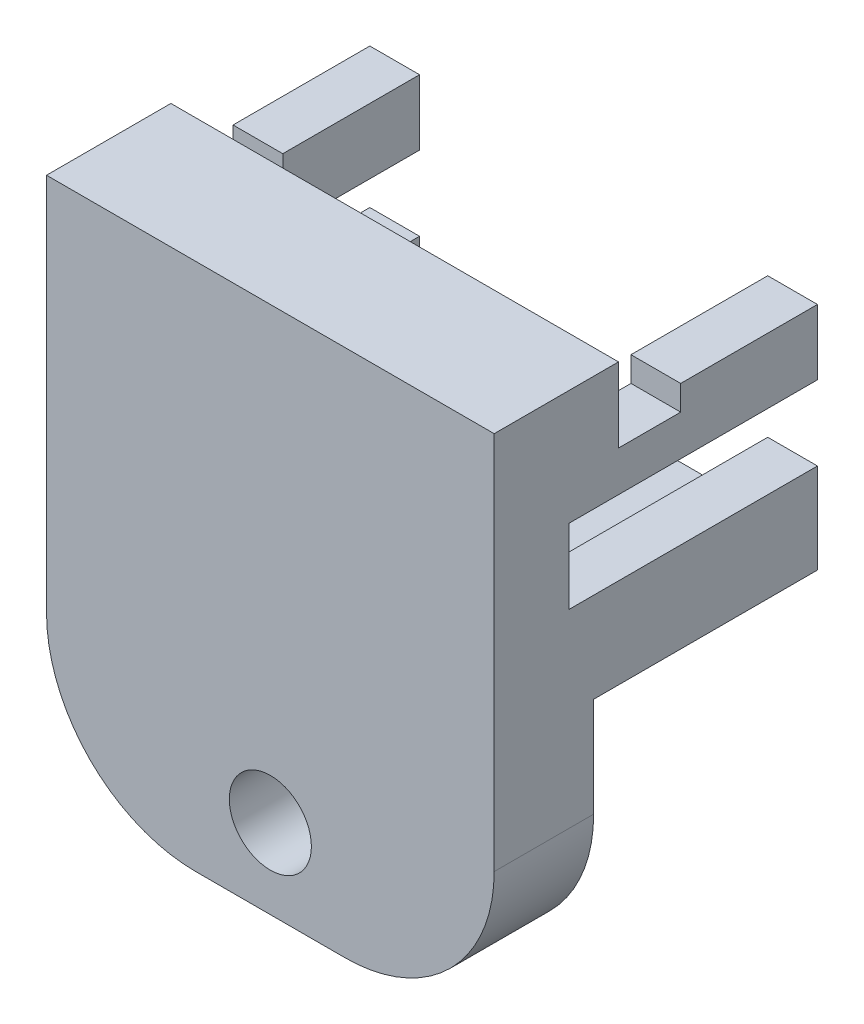
ISO-10303-21;
HEADER;
FILE_DESCRIPTION(('STEP AP214'),'2;1');
FILE_NAME('part.step','',(''),(''),'','','');
FILE_SCHEMA(('AUTOMOTIVE_DESIGN { 1 0 10303 214 1 1 1 1 }'));
ENDSEC;
DATA;
#1=APPLICATION_CONTEXT('core data for automotive mechanical design processes');
#2=APPLICATION_PROTOCOL_DEFINITION('international standard','automotive_design',2000,#1);
#3=PRODUCT_CONTEXT('',#1,'mechanical');
#4=PRODUCT('Part','Part','',(#3));
#5=PRODUCT_RELATED_PRODUCT_CATEGORY('part','',(#4));
#6=PRODUCT_DEFINITION_FORMATION('','',#4);
#7=PRODUCT_DEFINITION_CONTEXT('part definition',#1,'design');
#8=PRODUCT_DEFINITION('design','',#6,#7);
#9=PRODUCT_DEFINITION_SHAPE('','',#8);
#10=(LENGTH_UNIT() NAMED_UNIT(*) SI_UNIT(.MILLI.,.METRE.));
#11=(NAMED_UNIT(*) PLANE_ANGLE_UNIT() SI_UNIT($,.RADIAN.));
#12=(NAMED_UNIT(*) SI_UNIT($,.STERADIAN.) SOLID_ANGLE_UNIT());
#13=UNCERTAINTY_MEASURE_WITH_UNIT(LENGTH_MEASURE(1.E-05),#10,'distance_accuracy_value','');
#14=(GEOMETRIC_REPRESENTATION_CONTEXT(3) GLOBAL_UNCERTAINTY_ASSIGNED_CONTEXT((#13)) GLOBAL_UNIT_ASSIGNED_CONTEXT((#10,
#11,#12)) REPRESENTATION_CONTEXT('',''));
#15=CARTESIAN_POINT('',(0.,0.,0.));
#16=DIRECTION('',(0.,0.,1.));
#17=DIRECTION('',(1.,0.,0.));
#18=AXIS2_PLACEMENT_3D('',#15,#16,#17);
#19=CARTESIAN_POINT('',(0.,0.,-10.));
#20=DIRECTION('',(0.,0.,-1.));
#21=DIRECTION('',(-1.,0.,0.));
#22=AXIS2_PLACEMENT_3D('',#19,#20,#21);
#23=PLANE('',#22);
#24=DIRECTION('',(0.,-1.,0.));
#25=VECTOR('',#24,1.);
#26=CARTESIAN_POINT('',(9.,7.625,-10.));
#27=LINE('',#26,#25);
#28=CARTESIAN_POINT('',(9.,7.625,-10.));
#29=VERTEX_POINT('',#28);
#30=CARTESIAN_POINT('',(9.,4.,-10.));
#31=VERTEX_POINT('',#30);
#32=EDGE_CURVE('E358',#29,#31,#27,.T.);
#33=ORIENTED_EDGE('',*,*,#32,.T.);
#34=DIRECTION('',(1.,0.,0.));
#35=VECTOR('',#34,1.);
#36=CARTESIAN_POINT('',(-9.,4.,-10.));
#37=LINE('',#36,#35);
#38=CARTESIAN_POINT('',(-9.,4.,-10.));
#39=VERTEX_POINT('',#38);
#40=EDGE_CURVE('E268',#39,#31,#37,.T.);
#41=ORIENTED_EDGE('',*,*,#40,.F.);
#42=DIRECTION('',(0.,1.,0.));
#43=VECTOR('',#42,1.);
#44=CARTESIAN_POINT('',(-9.,3.,-10.));
#45=LINE('',#44,#43);
#46=CARTESIAN_POINT('',(-9.,7.625,-10.));
#47=VERTEX_POINT('',#46);
#48=EDGE_CURVE('E360',#39,#47,#45,.T.);
#49=ORIENTED_EDGE('',*,*,#48,.T.);
#50=DIRECTION('',(1.,0.,0.));
#51=VECTOR('',#50,1.);
#52=CARTESIAN_POINT('',(-9.,7.625,-10.));
#53=LINE('',#52,#51);
#54=CARTESIAN_POINT('',(-7.,7.625,-10.));
#55=VERTEX_POINT('',#54);
#56=EDGE_CURVE('E348',#47,#55,#53,.T.);
#57=ORIENTED_EDGE('',*,*,#56,.T.);
#58=DIRECTION('',(0.,-1.,0.));
#59=VECTOR('',#58,1.);
#60=CARTESIAN_POINT('',(-7.,7.625,-10.));
#61=LINE('',#60,#59);
#62=CARTESIAN_POINT('',(-7.,5.,-10.));
#63=VERTEX_POINT('',#62);
#64=EDGE_CURVE('E350',#55,#63,#61,.T.);
#65=ORIENTED_EDGE('',*,*,#64,.T.);
#66=DIRECTION('',(1.,0.,0.));
#67=VECTOR('',#66,1.);
#68=CARTESIAN_POINT('',(-7.,5.,-10.));
#69=LINE('',#68,#67);
#70=CARTESIAN_POINT('',(7.,5.,-10.));
#71=VERTEX_POINT('',#70);
#72=EDGE_CURVE('E352',#63,#71,#69,.T.);
#73=ORIENTED_EDGE('',*,*,#72,.T.);
#74=DIRECTION('',(0.,1.,0.));
#75=VECTOR('',#74,1.);
#76=CARTESIAN_POINT('',(7.,5.,-10.));
#77=LINE('',#76,#75);
#78=CARTESIAN_POINT('',(7.,7.625,-10.));
#79=VERTEX_POINT('',#78);
#80=EDGE_CURVE('E354',#71,#79,#77,.T.);
#81=ORIENTED_EDGE('',*,*,#80,.T.);
#82=DIRECTION('',(1.,0.,0.));
#83=VECTOR('',#82,1.);
#84=CARTESIAN_POINT('',(7.,7.625,-10.));
#85=LINE('',#84,#83);
#86=EDGE_CURVE('E356',#79,#29,#85,.T.);
#87=ORIENTED_EDGE('',*,*,#86,.T.);
#88=EDGE_LOOP('',(#33,#41,#49,#57,#65,#73,#81,#87));
#89=FACE_BOUND('',#88,.T.);
#90=ADVANCED_FACE('F34',(#89),#23,.T.);
#91=CARTESIAN_POINT('',(0.,13.25,-15.));
#92=DIRECTION('',(0.,-1.,0.));
#93=DIRECTION('',(0.,0.,-1.));
#94=AXIS2_PLACEMENT_3D('',#91,#92,#93);
#95=PLANE('',#94);
#96=DIRECTION('',(0.,0.,1.));
#97=VECTOR('',#96,1.);
#98=CARTESIAN_POINT('',(-7.,13.25,-15.));
#99=LINE('',#98,#97);
#100=CARTESIAN_POINT('',(-7.,13.25,-2.));
#101=VERTEX_POINT('',#100);
#102=CARTESIAN_POINT('',(-7.,13.25,0.));
#103=VERTEX_POINT('',#102);
#104=EDGE_CURVE('E439',#101,#103,#99,.T.);
#105=ORIENTED_EDGE('',*,*,#104,.F.);
#106=DIRECTION('',(-1.,0.,0.));
#107=VECTOR('',#106,1.);
#108=CARTESIAN_POINT('',(9.,13.25,-2.));
#109=LINE('',#108,#107);
#110=CARTESIAN_POINT('',(1.58333333333333,13.25,-2.));
#111=VERTEX_POINT('',#110);
#112=EDGE_CURVE('E320',#111,#101,#109,.T.);
#113=ORIENTED_EDGE('',*,*,#112,.F.);
#114=DIRECTION('',(0.,0.,1.));
#115=VECTOR('',#114,1.);
#116=CARTESIAN_POINT('',(1.58333333333333,13.25,-2.));
#117=LINE('',#116,#115);
#118=CARTESIAN_POINT('',(1.58333333333333,13.25,0.));
#119=VERTEX_POINT('',#118);
#120=EDGE_CURVE('E380',#111,#119,#117,.T.);
#121=ORIENTED_EDGE('',*,*,#120,.T.);
#122=DIRECTION('',(1.,0.,0.));
#123=VECTOR('',#122,1.);
#124=CARTESIAN_POINT('',(0.,13.25,0.));
#125=LINE('',#124,#123);
#126=EDGE_CURVE('E436',#103,#119,#125,.T.);
#127=ORIENTED_EDGE('',*,*,#126,.F.);
#128=EDGE_LOOP('',(#105,#113,#121,#127));
#129=FACE_BOUND('',#128,.T.);
#130=ADVANCED_FACE('F563',(#129),#95,.T.);
#131=DIRECTION('',(0.,0.,1.));
#132=VECTOR('',#131,1.);
#133=CARTESIAN_POINT('',(3.08333333333333,13.25,-2.));
#134=LINE('',#133,#132);
#135=CARTESIAN_POINT('',(3.08333333333333,13.25,-2.));
#136=VERTEX_POINT('',#135);
#137=CARTESIAN_POINT('',(3.08333333333333,13.25,0.));
#138=VERTEX_POINT('',#137);
#139=EDGE_CURVE('E377',#136,#138,#134,.T.);
#140=ORIENTED_EDGE('',*,*,#139,.F.);
#141=CARTESIAN_POINT('',(7.,13.25,-2.));
#142=VERTEX_POINT('',#141);
#143=EDGE_CURVE('E324',#142,#136,#109,.T.);
#144=ORIENTED_EDGE('',*,*,#143,.F.);
#145=DIRECTION('',(0.,0.,1.));
#146=VECTOR('',#145,1.);
#147=CARTESIAN_POINT('',(7.,13.25,-15.));
#148=LINE('',#147,#146);
#149=CARTESIAN_POINT('',(7.,13.25,0.));
#150=VERTEX_POINT('',#149);
#151=EDGE_CURVE('E443',#142,#150,#148,.T.);
#152=ORIENTED_EDGE('',*,*,#151,.T.);
#153=EDGE_CURVE('E435',#138,#150,#125,.T.);
#154=ORIENTED_EDGE('',*,*,#153,.F.);
#155=EDGE_LOOP('',(#140,#144,#152,#154));
#156=FACE_BOUND('',#155,.T.);
#157=ADVANCED_FACE('F544',(#156),#95,.T.);
#158=CARTESIAN_POINT('',(0.,15.25,3.));
#159=DIRECTION('',(0.,-1.,0.));
#160=DIRECTION('',(0.,0.,-1.));
#161=AXIS2_PLACEMENT_3D('',#158,#159,#160);
#162=PLANE('',#161);
#163=DIRECTION('',(1.,0.,0.));
#164=VECTOR('',#163,1.);
#165=CARTESIAN_POINT('',(9.,15.25,-2.));
#166=LINE('',#165,#164);
#167=CARTESIAN_POINT('',(-9.,15.25,-2.));
#168=VERTEX_POINT('',#167);
#169=CARTESIAN_POINT('',(9.,15.25,-2.));
#170=VERTEX_POINT('',#169);
#171=EDGE_CURVE('E327',#168,#170,#166,.T.);
#172=ORIENTED_EDGE('',*,*,#171,.F.);
#173=DIRECTION('',(0.,0.,-1.));
#174=VECTOR('',#173,1.);
#175=CARTESIAN_POINT('',(-9.,15.25,3.));
#176=LINE('',#175,#174);
#177=CARTESIAN_POINT('',(-9.,15.25,3.));
#178=VERTEX_POINT('',#177);
#179=EDGE_CURVE('E463',#178,#168,#176,.T.);
#180=ORIENTED_EDGE('',*,*,#179,.F.);
#181=DIRECTION('',(-1.,0.,0.));
#182=VECTOR('',#181,1.);
#183=CARTESIAN_POINT('',(0.,15.25,3.));
#184=LINE('',#183,#182);
#185=CARTESIAN_POINT('',(9.,15.25,3.));
#186=VERTEX_POINT('',#185);
#187=EDGE_CURVE('E450',#186,#178,#184,.T.);
#188=ORIENTED_EDGE('',*,*,#187,.F.);
#189=DIRECTION('',(0.,0.,-1.));
#190=VECTOR('',#189,1.);
#191=CARTESIAN_POINT('',(9.,15.25,3.));
#192=LINE('',#191,#190);
#193=EDGE_CURVE('E598',#186,#170,#192,.T.);
#194=ORIENTED_EDGE('',*,*,#193,.T.);
#195=EDGE_LOOP('',(#172,#180,#188,#194));
#196=FACE_BOUND('',#195,.T.);
#197=ADVANCED_FACE('F596',(#196),#162,.F.);
#198=CARTESIAN_POINT('',(0.,0.,-10.));
#199=DIRECTION('',(0.,0.,-1.));
#200=DIRECTION('',(-1.,0.,0.));
#201=AXIS2_PLACEMENT_3D('',#198,#199,#200);
#202=PLANE('',#201);
#203=DIRECTION('',(-1.,0.,0.));
#204=VECTOR('',#203,1.);
#205=CARTESIAN_POINT('',(9.,13.25,-10.));
#206=LINE('',#205,#204);
#207=CARTESIAN_POINT('',(9.,13.25,-10.));
#208=VERTEX_POINT('',#207);
#209=CARTESIAN_POINT('',(7.,13.25,-10.));
#210=VERTEX_POINT('',#209);
#211=EDGE_CURVE('E321',#208,#210,#206,.T.);
#212=ORIENTED_EDGE('',*,*,#211,.F.);
#213=DIRECTION('',(0.,-1.,0.));
#214=VECTOR('',#213,1.);
#215=CARTESIAN_POINT('',(9.,15.25,-10.));
#216=LINE('',#215,#214);
#217=CARTESIAN_POINT('',(9.,10.625,-10.));
#218=VERTEX_POINT('',#217);
#219=EDGE_CURVE('E341',#208,#218,#216,.T.);
#220=ORIENTED_EDGE('',*,*,#219,.T.);
#221=DIRECTION('',(-1.,0.,0.));
#222=VECTOR('',#221,1.);
#223=CARTESIAN_POINT('',(9.,10.625,-10.));
#224=LINE('',#223,#222);
#225=CARTESIAN_POINT('',(7.,10.625,-10.));
#226=VERTEX_POINT('',#225);
#227=EDGE_CURVE('E343',#218,#226,#224,.T.);
#228=ORIENTED_EDGE('',*,*,#227,.T.);
#229=DIRECTION('',(0.,1.,0.));
#230=VECTOR('',#229,1.);
#231=CARTESIAN_POINT('',(7.,10.625,-10.));
#232=LINE('',#231,#230);
#233=EDGE_CURVE('E345',#226,#210,#232,.T.);
#234=ORIENTED_EDGE('',*,*,#233,.T.);
#235=EDGE_LOOP('',(#212,#220,#228,#234));
#236=FACE_BOUND('',#235,.T.);
#237=ADVANCED_FACE('F520',(#236),#202,.T.);
#238=CARTESIAN_POINT('',(-9.,0.,3.));
#239=DIRECTION('',(1.,0.,0.));
#240=DIRECTION('',(0.,0.,-1.));
#241=AXIS2_PLACEMENT_3D('',#238,#239,#240);
#242=PLANE('',#241);
#243=DIRECTION('',(0.,0.,-1.));
#244=VECTOR('',#243,1.);
#245=CARTESIAN_POINT('',(-9.,4.,-1.));
#246=LINE('',#245,#244);
#247=CARTESIAN_POINT('',(-9.,4.,-1.));
#248=VERTEX_POINT('',#247);
#249=EDGE_CURVE('E264',#248,#39,#246,.T.);
#250=ORIENTED_EDGE('',*,*,#249,.F.);
#251=DIRECTION('',(0.,1.,0.));
#252=VECTOR('',#251,1.);
#253=CARTESIAN_POINT('',(-9.,-4.5,-1.));
#254=LINE('',#253,#252);
#255=CARTESIAN_POINT('',(-9.,0.,-1.));
#256=VERTEX_POINT('',#255);
#257=EDGE_CURVE('E254',#256,#248,#254,.T.);
#258=ORIENTED_EDGE('',*,*,#257,.F.);
#259=DIRECTION('',(0.,0.,-1.));
#260=VECTOR('',#259,1.);
#261=CARTESIAN_POINT('',(-9.,0.,3.));
#262=LINE('',#261,#260);
#263=CARTESIAN_POINT('',(-9.,0.,3.));
#264=VERTEX_POINT('',#263);
#265=EDGE_CURVE('E476',#256,#264,#262,.F.);
#266=ORIENTED_EDGE('',*,*,#265,.T.);
#267=DIRECTION('',(0.,-1.,0.));
#268=VECTOR('',#267,1.);
#269=CARTESIAN_POINT('',(-9.,0.,3.));
#270=LINE('',#269,#268);
#271=EDGE_CURVE('E485',#178,#264,#270,.T.);
#272=ORIENTED_EDGE('',*,*,#271,.F.);
#273=ORIENTED_EDGE('',*,*,#179,.T.);
#274=DIRECTION('',(0.,1.,0.));
#275=VECTOR('',#274,1.);
#276=CARTESIAN_POINT('',(-9.,15.25,-2.));
#277=LINE('',#276,#275);
#278=CARTESIAN_POINT('',(-9.,12.25,-2.));
#279=VERTEX_POINT('',#278);
#280=EDGE_CURVE('E325',#279,#168,#277,.T.);
#281=ORIENTED_EDGE('',*,*,#280,.F.);
#282=DIRECTION('',(0.,0.,1.));
#283=VECTOR('',#282,1.);
#284=CARTESIAN_POINT('',(-9.,12.25,-2.));
#285=LINE('',#284,#283);
#286=CARTESIAN_POINT('',(-9.,12.25,-4.5));
#287=VERTEX_POINT('',#286);
#288=EDGE_CURVE('E282',#287,#279,#285,.T.);
#289=ORIENTED_EDGE('',*,*,#288,.F.);
#290=DIRECTION('',(0.,1.,0.));
#291=VECTOR('',#290,1.);
#292=CARTESIAN_POINT('',(-9.,12.25,-4.5));
#293=LINE('',#292,#291);
#294=CARTESIAN_POINT('',(-9.,13.25,-4.5));
#295=VERTEX_POINT('',#294);
#296=EDGE_CURVE('E290',#287,#295,#293,.T.);
#297=ORIENTED_EDGE('',*,*,#296,.T.);
#298=DIRECTION('',(0.,0.,-1.));
#299=VECTOR('',#298,1.);
#300=CARTESIAN_POINT('',(-9.,13.25,-2.));
#301=LINE('',#300,#299);
#302=CARTESIAN_POINT('',(-9.,13.25,-10.));
#303=VERTEX_POINT('',#302);
#304=EDGE_CURVE('E331',#295,#303,#301,.T.);
#305=ORIENTED_EDGE('',*,*,#304,.T.);
#306=DIRECTION('',(0.,1.,0.));
#307=VECTOR('',#306,1.);
#308=CARTESIAN_POINT('',(-9.,10.625,-10.));
#309=LINE('',#308,#307);
#310=CARTESIAN_POINT('',(-9.,10.625,-10.));
#311=VERTEX_POINT('',#310);
#312=EDGE_CURVE('E338',#311,#303,#309,.T.);
#313=ORIENTED_EDGE('',*,*,#312,.F.);
#314=DIRECTION('',(0.,0.,-1.));
#315=VECTOR('',#314,1.);
#316=CARTESIAN_POINT('',(-9.,10.625,0.));
#317=LINE('',#316,#315);
#318=CARTESIAN_POINT('',(-9.,10.625,0.));
#319=VERTEX_POINT('',#318);
#320=EDGE_CURVE('E397',#319,#311,#317,.T.);
#321=ORIENTED_EDGE('',*,*,#320,.F.);
#322=DIRECTION('',(0.,1.,0.));
#323=VECTOR('',#322,1.);
#324=CARTESIAN_POINT('',(-9.,0.,0.));
#325=LINE('',#324,#323);
#326=CARTESIAN_POINT('',(-9.,7.625,0.));
#327=VERTEX_POINT('',#326);
#328=EDGE_CURVE('E388',#327,#319,#325,.T.);
#329=ORIENTED_EDGE('',*,*,#328,.F.);
#330=DIRECTION('',(0.,0.,-1.));
#331=VECTOR('',#330,1.);
#332=CARTESIAN_POINT('',(-9.,7.625,0.));
#333=LINE('',#332,#331);
#334=EDGE_CURVE('E400',#327,#47,#333,.T.);
#335=ORIENTED_EDGE('',*,*,#334,.T.);
#336=ORIENTED_EDGE('',*,*,#48,.F.);
#337=EDGE_LOOP('',(#250,#258,#266,#272,#273,#281,#289,#297,#305,#313,#321,#329,#335,#336));
#338=FACE_BOUND('',#337,.T.);
#339=ADVANCED_FACE('F496',(#338),#242,.F.);
#340=CARTESIAN_POINT('',(9.,0.,3.));
#341=DIRECTION('',(1.,0.,0.));
#342=DIRECTION('',(0.,0.,-1.));
#343=AXIS2_PLACEMENT_3D('',#340,#341,#342);
#344=PLANE('',#343);
#345=DIRECTION('',(0.,1.,0.));
#346=VECTOR('',#345,1.);
#347=CARTESIAN_POINT('',(9.,-4.5,-1.));
#348=LINE('',#347,#346);
#349=CARTESIAN_POINT('',(9.,0.,-1.));
#350=VERTEX_POINT('',#349);
#351=CARTESIAN_POINT('',(9.,4.,-1.));
#352=VERTEX_POINT('',#351);
#353=EDGE_CURVE('E243',#350,#352,#348,.T.);
#354=ORIENTED_EDGE('',*,*,#353,.T.);
#355=DIRECTION('',(0.,0.,1.));
#356=VECTOR('',#355,1.);
#357=CARTESIAN_POINT('',(9.,4.,-10.));
#358=LINE('',#357,#356);
#359=EDGE_CURVE('E248',#31,#352,#358,.T.);
#360=ORIENTED_EDGE('',*,*,#359,.F.);
#361=ORIENTED_EDGE('',*,*,#32,.F.);
#362=DIRECTION('',(0.,0.,-1.));
#363=VECTOR('',#362,1.);
#364=CARTESIAN_POINT('',(9.,7.625,0.));
#365=LINE('',#364,#363);
#366=CARTESIAN_POINT('',(9.,7.625,0.));
#367=VERTEX_POINT('',#366);
#368=EDGE_CURVE('E416',#367,#29,#365,.T.);
#369=ORIENTED_EDGE('',*,*,#368,.F.);
#370=DIRECTION('',(0.,-1.,0.));
#371=VECTOR('',#370,1.);
#372=CARTESIAN_POINT('',(9.,0.,0.));
#373=LINE('',#372,#371);
#374=CARTESIAN_POINT('',(9.,10.625,0.));
#375=VERTEX_POINT('',#374);
#376=EDGE_CURVE('E407',#375,#367,#373,.T.);
#377=ORIENTED_EDGE('',*,*,#376,.F.);
#378=DIRECTION('',(0.,0.,-1.));
#379=VECTOR('',#378,1.);
#380=CARTESIAN_POINT('',(9.,10.625,0.));
#381=LINE('',#380,#379);
#382=EDGE_CURVE('E419',#375,#218,#381,.T.);
#383=ORIENTED_EDGE('',*,*,#382,.T.);
#384=ORIENTED_EDGE('',*,*,#219,.F.);
#385=DIRECTION('',(0.,0.,-1.));
#386=VECTOR('',#385,1.);
#387=CARTESIAN_POINT('',(9.,13.25,-2.));
#388=LINE('',#387,#386);
#389=CARTESIAN_POINT('',(9.,13.25,-4.5));
#390=VERTEX_POINT('',#389);
#391=EDGE_CURVE('E329',#390,#208,#388,.T.);
#392=ORIENTED_EDGE('',*,*,#391,.F.);
#393=DIRECTION('',(0.,1.,0.));
#394=VECTOR('',#393,1.);
#395=CARTESIAN_POINT('',(9.,12.25,-4.5));
#396=LINE('',#395,#394);
#397=CARTESIAN_POINT('',(9.,12.25,-4.5));
#398=VERTEX_POINT('',#397);
#399=EDGE_CURVE('E57',#398,#390,#396,.T.);
#400=ORIENTED_EDGE('',*,*,#399,.F.);
#401=DIRECTION('',(0.,0.,-1.));
#402=VECTOR('',#401,1.);
#403=CARTESIAN_POINT('',(9.,12.25,-2.));
#404=LINE('',#403,#402);
#405=CARTESIAN_POINT('',(9.,12.25,-2.));
#406=VERTEX_POINT('',#405);
#407=EDGE_CURVE('E274',#406,#398,#404,.T.);
#408=ORIENTED_EDGE('',*,*,#407,.F.);
#409=DIRECTION('',(0.,-1.,0.));
#410=VECTOR('',#409,1.);
#411=CARTESIAN_POINT('',(9.,15.25,-2.));
#412=LINE('',#411,#410);
#413=EDGE_CURVE('E318',#170,#406,#412,.T.);
#414=ORIENTED_EDGE('',*,*,#413,.F.);
#415=ORIENTED_EDGE('',*,*,#193,.F.);
#416=DIRECTION('',(0.,-1.,0.));
#417=VECTOR('',#416,1.);
#418=CARTESIAN_POINT('',(9.,0.,3.));
#419=LINE('',#418,#417);
#420=CARTESIAN_POINT('',(9.,0.,3.));
#421=VERTEX_POINT('',#420);
#422=EDGE_CURVE('E599',#186,#421,#419,.T.);
#423=ORIENTED_EDGE('',*,*,#422,.T.);
#424=DIRECTION('',(0.,0.,1.));
#425=VECTOR('',#424,1.);
#426=CARTESIAN_POINT('',(9.,0.,3.));
#427=LINE('',#426,#425);
#428=EDGE_CURVE('E11',#421,#350,#427,.F.);
#429=ORIENTED_EDGE('',*,*,#428,.T.);
#430=EDGE_LOOP('',(#354,#360,#361,#369,#377,#383,#384,#392,#400,#408,#414,#415,#423,#429));
#431=FACE_BOUND('',#430,.T.);
#432=ADVANCED_FACE('F245',(#431),#344,.T.);
#433=CARTESIAN_POINT('',(-7.,0.,-15.));
#434=DIRECTION('',(1.,0.,0.));
#435=DIRECTION('',(0.,0.,-1.));
#436=AXIS2_PLACEMENT_3D('',#433,#434,#435);
#437=PLANE('',#436);
#438=DIRECTION('',(0.,-1.,0.));
#439=VECTOR('',#438,1.);
#440=CARTESIAN_POINT('',(-7.,0.,-2.));
#441=LINE('',#440,#439);
#442=CARTESIAN_POINT('',(-7.,12.25,-2.));
#443=VERTEX_POINT('',#442);
#444=EDGE_CURVE('E299',#101,#443,#441,.T.);
#445=ORIENTED_EDGE('',*,*,#444,.F.);
#446=ORIENTED_EDGE('',*,*,#104,.T.);
#447=DIRECTION('',(0.,1.,0.));
#448=VECTOR('',#447,1.);
#449=CARTESIAN_POINT('',(-7.,0.,0.));
#450=LINE('',#449,#448);
#451=CARTESIAN_POINT('',(-7.,10.625,0.));
#452=VERTEX_POINT('',#451);
#453=EDGE_CURVE('E415',#452,#103,#450,.T.);
#454=ORIENTED_EDGE('',*,*,#453,.F.);
#455=DIRECTION('',(0.,0.,-1.));
#456=VECTOR('',#455,1.);
#457=CARTESIAN_POINT('',(-7.,10.625,0.));
#458=LINE('',#457,#456);
#459=CARTESIAN_POINT('',(-7.,10.625,-10.));
#460=VERTEX_POINT('',#459);
#461=EDGE_CURVE('E393',#452,#460,#458,.T.);
#462=ORIENTED_EDGE('',*,*,#461,.T.);
#463=DIRECTION('',(0.,-1.,0.));
#464=VECTOR('',#463,1.);
#465=CARTESIAN_POINT('',(-7.,13.25,-10.));
#466=LINE('',#465,#464);
#467=CARTESIAN_POINT('',(-7.,13.25,-10.));
#468=VERTEX_POINT('',#467);
#469=EDGE_CURVE('E333',#468,#460,#466,.T.);
#470=ORIENTED_EDGE('',*,*,#469,.F.);
#471=CARTESIAN_POINT('',(-7.,13.25,-4.5));
#472=VERTEX_POINT('',#471);
#473=EDGE_CURVE('E440',#468,#472,#99,.T.);
#474=ORIENTED_EDGE('',*,*,#473,.T.);
#475=DIRECTION('',(0.,1.,0.));
#476=VECTOR('',#475,1.);
#477=CARTESIAN_POINT('',(-7.,0.,-4.5));
#478=LINE('',#477,#476);
#479=CARTESIAN_POINT('',(-7.,12.25,-4.5));
#480=VERTEX_POINT('',#479);
#481=EDGE_CURVE('E49',#480,#472,#478,.T.);
#482=ORIENTED_EDGE('',*,*,#481,.F.);
#483=DIRECTION('',(0.,0.,1.));
#484=VECTOR('',#483,1.);
#485=CARTESIAN_POINT('',(-7.,12.25,-15.));
#486=LINE('',#485,#484);
#487=EDGE_CURVE('E304',#480,#443,#486,.T.);
#488=ORIENTED_EDGE('',*,*,#487,.T.);
#489=EDGE_LOOP('',(#445,#446,#454,#462,#470,#474,#482,#488));
#490=FACE_BOUND('',#489,.T.);
#491=ADVANCED_FACE('F568',(#490),#437,.T.);
#492=CARTESIAN_POINT('',(7.,0.,-15.));
#493=DIRECTION('',(-1.,0.,0.));
#494=DIRECTION('',(0.,0.,1.));
#495=AXIS2_PLACEMENT_3D('',#492,#493,#494);
#496=PLANE('',#495);
#497=DIRECTION('',(0.,1.,0.));
#498=VECTOR('',#497,1.);
#499=CARTESIAN_POINT('',(7.,0.,-2.));
#500=LINE('',#499,#498);
#501=CARTESIAN_POINT('',(7.,12.25,-2.));
#502=VERTEX_POINT('',#501);
#503=EDGE_CURVE('E297',#502,#142,#500,.T.);
#504=ORIENTED_EDGE('',*,*,#503,.F.);
#505=DIRECTION('',(0.,0.,-1.));
#506=VECTOR('',#505,1.);
#507=CARTESIAN_POINT('',(7.,12.25,-15.));
#508=LINE('',#507,#506);
#509=CARTESIAN_POINT('',(7.,12.25,-4.5));
#510=VERTEX_POINT('',#509);
#511=EDGE_CURVE('E301',#502,#510,#508,.T.);
#512=ORIENTED_EDGE('',*,*,#511,.T.);
#513=DIRECTION('',(0.,-1.,0.));
#514=VECTOR('',#513,1.);
#515=CARTESIAN_POINT('',(7.,0.,-4.5));
#516=LINE('',#515,#514);
#517=CARTESIAN_POINT('',(7.,13.25,-4.5));
#518=VERTEX_POINT('',#517);
#519=EDGE_CURVE('E293',#518,#510,#516,.T.);
#520=ORIENTED_EDGE('',*,*,#519,.F.);
#521=EDGE_CURVE('E444',#210,#518,#148,.T.);
#522=ORIENTED_EDGE('',*,*,#521,.F.);
#523=ORIENTED_EDGE('',*,*,#233,.F.);
#524=DIRECTION('',(0.,0.,-1.));
#525=VECTOR('',#524,1.);
#526=CARTESIAN_POINT('',(7.,10.625,0.));
#527=LINE('',#526,#525);
#528=CARTESIAN_POINT('',(7.,10.625,0.));
#529=VERTEX_POINT('',#528);
#530=EDGE_CURVE('E411',#529,#226,#527,.T.);
#531=ORIENTED_EDGE('',*,*,#530,.F.);
#532=DIRECTION('',(0.,-1.,0.));
#533=VECTOR('',#532,1.);
#534=CARTESIAN_POINT('',(7.,0.,0.));
#535=LINE('',#534,#533);
#536=EDGE_CURVE('E432',#150,#529,#535,.T.);
#537=ORIENTED_EDGE('',*,*,#536,.F.);
#538=ORIENTED_EDGE('',*,*,#151,.F.);
#539=EDGE_LOOP('',(#504,#512,#520,#522,#523,#531,#537,#538));
#540=FACE_BOUND('',#539,.T.);
#541=ADVANCED_FACE('F524',(#540),#496,.T.);
#542=CARTESIAN_POINT('',(0.,10.625,0.));
#543=DIRECTION('',(0.,1.,0.));
#544=DIRECTION('',(0.,0.,1.));
#545=AXIS2_PLACEMENT_3D('',#542,#543,#544);
#546=PLANE('',#545);
#547=ORIENTED_EDGE('',*,*,#227,.F.);
#548=ORIENTED_EDGE('',*,*,#382,.F.);
#549=DIRECTION('',(1.,0.,0.));
#550=VECTOR('',#549,1.);
#551=CARTESIAN_POINT('',(0.,10.625,0.));
#552=LINE('',#551,#550);
#553=EDGE_CURVE('E396',#529,#375,#552,.T.);
#554=ORIENTED_EDGE('',*,*,#553,.F.);
#555=ORIENTED_EDGE('',*,*,#530,.T.);
#556=EDGE_LOOP('',(#547,#548,#554,#555));
#557=FACE_BOUND('',#556,.T.);
#558=ADVANCED_FACE('F515',(#557),#546,.F.);
#559=CARTESIAN_POINT('',(0.,10.625,0.));
#560=DIRECTION('',(0.,1.,0.));
#561=DIRECTION('',(0.,0.,1.));
#562=AXIS2_PLACEMENT_3D('',#559,#560,#561);
#563=PLANE('',#562);
#564=DIRECTION('',(-1.,0.,0.));
#565=VECTOR('',#564,1.);
#566=CARTESIAN_POINT('',(-7.,10.625,-10.));
#567=LINE('',#566,#565);
#568=EDGE_CURVE('E336',#460,#311,#567,.T.);
#569=ORIENTED_EDGE('',*,*,#568,.F.);
#570=ORIENTED_EDGE('',*,*,#461,.F.);
#571=DIRECTION('',(1.,0.,0.));
#572=VECTOR('',#571,1.);
#573=CARTESIAN_POINT('',(0.,10.625,0.));
#574=LINE('',#573,#572);
#575=EDGE_CURVE('E390',#319,#452,#574,.T.);
#576=ORIENTED_EDGE('',*,*,#575,.F.);
#577=ORIENTED_EDGE('',*,*,#320,.T.);
#578=EDGE_LOOP('',(#569,#570,#576,#577));
#579=FACE_BOUND('',#578,.T.);
#580=ADVANCED_FACE('F577',(#579),#563,.F.);
#581=DIRECTION('',(0.,0.,-1.));
#582=VECTOR('',#581,1.);
#583=CARTESIAN_POINT('',(7.,7.625,0.));
#584=LINE('',#583,#582);
#585=CARTESIAN_POINT('',(7.,7.625,0.));
#586=VERTEX_POINT('',#585);
#587=EDGE_CURVE('E412',#586,#79,#584,.T.);
#588=ORIENTED_EDGE('',*,*,#587,.T.);
#589=ORIENTED_EDGE('',*,*,#80,.F.);
#590=DIRECTION('',(0.,0.,1.));
#591=VECTOR('',#590,1.);
#592=CARTESIAN_POINT('',(7.,5.,-15.));
#593=LINE('',#592,#591);
#594=CARTESIAN_POINT('',(7.,5.,0.));
#595=VERTEX_POINT('',#594);
#596=EDGE_CURVE('E447',#71,#595,#593,.T.);
#597=ORIENTED_EDGE('',*,*,#596,.T.);
#598=EDGE_CURVE('E431',#586,#595,#535,.T.);
#599=ORIENTED_EDGE('',*,*,#598,.F.);
#600=EDGE_LOOP('',(#588,#589,#597,#599));
#601=FACE_BOUND('',#600,.T.);
#602=ADVANCED_FACE('F631',(#601),#496,.T.);
#603=DIRECTION('',(0.,0.,1.));
#604=VECTOR('',#603,1.);
#605=CARTESIAN_POINT('',(-7.,5.,-15.));
#606=LINE('',#605,#604);
#607=CARTESIAN_POINT('',(-7.,5.,0.));
#608=VERTEX_POINT('',#607);
#609=EDGE_CURVE('E453',#63,#608,#606,.T.);
#610=ORIENTED_EDGE('',*,*,#609,.F.);
#611=ORIENTED_EDGE('',*,*,#64,.F.);
#612=DIRECTION('',(0.,0.,-1.));
#613=VECTOR('',#612,1.);
#614=CARTESIAN_POINT('',(-7.,7.625,0.));
#615=LINE('',#614,#613);
#616=CARTESIAN_POINT('',(-7.,7.625,0.));
#617=VERTEX_POINT('',#616);
#618=EDGE_CURVE('E392',#617,#55,#615,.T.);
#619=ORIENTED_EDGE('',*,*,#618,.F.);
#620=EDGE_CURVE('E424',#608,#617,#450,.T.);
#621=ORIENTED_EDGE('',*,*,#620,.F.);
#622=EDGE_LOOP('',(#610,#611,#619,#621));
#623=FACE_BOUND('',#622,.T.);
#624=ADVANCED_FACE('F637',(#623),#437,.T.);
#625=CARTESIAN_POINT('',(0.,7.625,0.));
#626=DIRECTION('',(0.,-1.,0.));
#627=DIRECTION('',(0.,0.,-1.));
#628=AXIS2_PLACEMENT_3D('',#625,#626,#627);
#629=PLANE('',#628);
#630=ORIENTED_EDGE('',*,*,#86,.F.);
#631=ORIENTED_EDGE('',*,*,#587,.F.);
#632=DIRECTION('',(-1.,0.,0.));
#633=VECTOR('',#632,1.);
#634=CARTESIAN_POINT('',(0.,7.625,0.));
#635=LINE('',#634,#633);
#636=EDGE_CURVE('E409',#367,#586,#635,.T.);
#637=ORIENTED_EDGE('',*,*,#636,.F.);
#638=ORIENTED_EDGE('',*,*,#368,.T.);
#639=EDGE_LOOP('',(#630,#631,#637,#638));
#640=FACE_BOUND('',#639,.T.);
#641=ADVANCED_FACE('F505',(#640),#629,.F.);
#642=CARTESIAN_POINT('',(0.,7.625,0.));
#643=DIRECTION('',(0.,-1.,0.));
#644=DIRECTION('',(0.,0.,-1.));
#645=AXIS2_PLACEMENT_3D('',#642,#643,#644);
#646=PLANE('',#645);
#647=ORIENTED_EDGE('',*,*,#56,.F.);
#648=ORIENTED_EDGE('',*,*,#334,.F.);
#649=DIRECTION('',(-1.,0.,0.));
#650=VECTOR('',#649,1.);
#651=CARTESIAN_POINT('',(0.,7.625,0.));
#652=LINE('',#651,#650);
#653=EDGE_CURVE('E385',#617,#327,#652,.T.);
#654=ORIENTED_EDGE('',*,*,#653,.F.);
#655=ORIENTED_EDGE('',*,*,#618,.T.);
#656=EDGE_LOOP('',(#647,#648,#654,#655));
#657=FACE_BOUND('',#656,.T.);
#658=ADVANCED_FACE('F622',(#657),#646,.F.);
#659=CARTESIAN_POINT('',(0.,5.,0.));
#660=DIRECTION('',(0.,-1.,0.));
#661=DIRECTION('',(0.,0.,-1.));
#662=AXIS2_PLACEMENT_3D('',#659,#660,#661);
#663=PLANE('',#662);
#664=ORIENTED_EDGE('',*,*,#72,.F.);
#665=ORIENTED_EDGE('',*,*,#609,.T.);
#666=DIRECTION('',(-1.,0.,0.));
#667=VECTOR('',#666,1.);
#668=CARTESIAN_POINT('',(0.,5.,0.));
#669=LINE('',#668,#667);
#670=CARTESIAN_POINT('',(1.58333333333333,5.,0.));
#671=VERTEX_POINT('',#670);
#672=EDGE_CURVE('E427',#671,#608,#669,.T.);
#673=ORIENTED_EDGE('',*,*,#672,.F.);
#674=DIRECTION('',(0.,0.,1.));
#675=VECTOR('',#674,1.);
#676=CARTESIAN_POINT('',(1.58333333333333,5.,-2.));
#677=LINE('',#676,#675);
#678=CARTESIAN_POINT('',(1.58333333333333,5.,-2.));
#679=VERTEX_POINT('',#678);
#680=EDGE_CURVE('E382',#679,#671,#677,.T.);
#681=ORIENTED_EDGE('',*,*,#680,.F.);
#682=DIRECTION('',(-1.,0.,0.));
#683=VECTOR('',#682,1.);
#684=CARTESIAN_POINT('',(0.,5.,-2.));
#685=LINE('',#684,#683);
#686=CARTESIAN_POINT('',(3.08333333333333,5.,-2.));
#687=VERTEX_POINT('',#686);
#688=EDGE_CURVE('E363',#687,#679,#685,.T.);
#689=ORIENTED_EDGE('',*,*,#688,.F.);
#690=DIRECTION('',(0.,0.,1.));
#691=VECTOR('',#690,1.);
#692=CARTESIAN_POINT('',(3.08333333333333,5.,-2.));
#693=LINE('',#692,#691);
#694=CARTESIAN_POINT('',(3.08333333333333,5.,0.));
#695=VERTEX_POINT('',#694);
#696=EDGE_CURVE('E371',#687,#695,#693,.T.);
#697=ORIENTED_EDGE('',*,*,#696,.T.);
#698=EDGE_CURVE('E428',#595,#695,#669,.T.);
#699=ORIENTED_EDGE('',*,*,#698,.F.);
#700=ORIENTED_EDGE('',*,*,#596,.F.);
#701=EDGE_LOOP('',(#664,#665,#673,#681,#689,#697,#699,#700));
#702=FACE_BOUND('',#701,.T.);
#703=ADVANCED_FACE('F553',(#702),#663,.F.);
#704=CARTESIAN_POINT('',(0.,0.,3.));
#705=DIRECTION('',(0.,0.,1.));
#706=DIRECTION('',(1.,0.,0.));
#707=AXIS2_PLACEMENT_3D('',#704,#705,#706);
#708=PLANE('',#707);
#709=CARTESIAN_POINT('',(0.,-2.8,3.));
#710=DIRECTION('',(0.,0.,1.));
#711=DIRECTION('',(1.,0.,0.));
#712=AXIS2_PLACEMENT_3D('',#709,#710,#711);
#713=CIRCLE('',#712,1.65);
#714=CARTESIAN_POINT('',(1.65,-2.8,3.));
#715=VERTEX_POINT('',#714);
#716=EDGE_CURVE('E255',#715,#715,#713,.T.);
#717=ORIENTED_EDGE('',*,*,#716,.F.);
#718=EDGE_LOOP('',(#717));
#719=FACE_BOUND('',#718,.T.);
#720=ORIENTED_EDGE('',*,*,#271,.T.);
#721=CARTESIAN_POINT('',(-3.,0.,3.));
#722=DIRECTION('',(0.,0.,1.));
#723=DIRECTION('',(1.,0.,0.));
#724=AXIS2_PLACEMENT_3D('',#721,#722,#723);
#725=CIRCLE('',#724,6.);
#726=CARTESIAN_POINT('',(-3.,-5.99999999999999,3.));
#727=VERTEX_POINT('',#726);
#728=EDGE_CURVE('E42',#264,#727,#725,.T.);
#729=ORIENTED_EDGE('',*,*,#728,.T.);
#730=DIRECTION('',(-1.,0.,0.));
#731=VECTOR('',#730,1.);
#732=CARTESIAN_POINT('',(9.,-5.99999999999999,3.));
#733=LINE('',#732,#731);
#734=CARTESIAN_POINT('',(3.,-5.99999999999999,3.));
#735=VERTEX_POINT('',#734);
#736=EDGE_CURVE('E310',#735,#727,#733,.T.);
#737=ORIENTED_EDGE('',*,*,#736,.F.);
#738=CARTESIAN_POINT('',(3.,0.,3.));
#739=DIRECTION('',(0.,0.,1.));
#740=DIRECTION('',(1.,0.,0.));
#741=AXIS2_PLACEMENT_3D('',#738,#739,#740);
#742=CIRCLE('',#741,6.);
#743=EDGE_CURVE('E478',#735,#421,#742,.T.);
#744=ORIENTED_EDGE('',*,*,#743,.T.);
#745=ORIENTED_EDGE('',*,*,#422,.F.);
#746=ORIENTED_EDGE('',*,*,#187,.T.);
#747=EDGE_LOOP('',(#720,#729,#737,#744,#745,#746));
#748=FACE_BOUND('',#747,.T.);
#749=ADVANCED_FACE('F483',(#719,#748),#708,.T.);
#750=CARTESIAN_POINT('',(0.,0.,0.));
#751=DIRECTION('',(0.,0.,1.));
#752=DIRECTION('',(1.,0.,0.));
#753=AXIS2_PLACEMENT_3D('',#750,#751,#752);
#754=PLANE('',#753);
#755=DIRECTION('',(0.,1.,0.));
#756=VECTOR('',#755,1.);
#757=CARTESIAN_POINT('',(1.58333333333333,0.,0.));
#758=LINE('',#757,#756);
#759=EDGE_CURVE('E362',#671,#119,#758,.T.);
#760=ORIENTED_EDGE('',*,*,#759,.F.);
#761=ORIENTED_EDGE('',*,*,#672,.T.);
#762=ORIENTED_EDGE('',*,*,#620,.T.);
#763=ORIENTED_EDGE('',*,*,#653,.T.);
#764=ORIENTED_EDGE('',*,*,#328,.T.);
#765=ORIENTED_EDGE('',*,*,#575,.T.);
#766=ORIENTED_EDGE('',*,*,#453,.T.);
#767=ORIENTED_EDGE('',*,*,#126,.T.);
#768=EDGE_LOOP('',(#760,#761,#762,#763,#764,#765,#766,#767));
#769=FACE_BOUND('',#768,.T.);
#770=ADVANCED_FACE('F570',(#769),#754,.F.);
#771=DIRECTION('',(0.,-1.,0.));
#772=VECTOR('',#771,1.);
#773=CARTESIAN_POINT('',(3.08333333333333,0.,0.));
#774=LINE('',#773,#772);
#775=EDGE_CURVE('E367',#138,#695,#774,.T.);
#776=ORIENTED_EDGE('',*,*,#775,.F.);
#777=ORIENTED_EDGE('',*,*,#153,.T.);
#778=ORIENTED_EDGE('',*,*,#536,.T.);
#779=ORIENTED_EDGE('',*,*,#553,.T.);
#780=ORIENTED_EDGE('',*,*,#376,.T.);
#781=ORIENTED_EDGE('',*,*,#636,.T.);
#782=ORIENTED_EDGE('',*,*,#598,.T.);
#783=ORIENTED_EDGE('',*,*,#698,.T.);
#784=EDGE_LOOP('',(#776,#777,#778,#779,#780,#781,#782,#783));
#785=FACE_BOUND('',#784,.T.);
#786=ADVANCED_FACE('F510',(#785),#754,.F.);
#787=CARTESIAN_POINT('',(1.58333333333333,0.,-2.));
#788=DIRECTION('',(1.,0.,0.));
#789=DIRECTION('',(0.,0.,-1.));
#790=AXIS2_PLACEMENT_3D('',#787,#788,#789);
#791=PLANE('',#790);
#792=ORIENTED_EDGE('',*,*,#759,.T.);
#793=ORIENTED_EDGE('',*,*,#120,.F.);
#794=DIRECTION('',(0.,1.,0.));
#795=VECTOR('',#794,1.);
#796=CARTESIAN_POINT('',(1.58333333333333,0.,-2.));
#797=LINE('',#796,#795);
#798=EDGE_CURVE('E366',#679,#111,#797,.T.);
#799=ORIENTED_EDGE('',*,*,#798,.F.);
#800=ORIENTED_EDGE('',*,*,#680,.T.);
#801=EDGE_LOOP('',(#792,#793,#799,#800));
#802=FACE_BOUND('',#801,.T.);
#803=ADVANCED_FACE('F559',(#802),#791,.F.);
#804=CARTESIAN_POINT('',(3.08333333333333,0.,-2.));
#805=DIRECTION('',(-1.,0.,0.));
#806=DIRECTION('',(0.,0.,1.));
#807=AXIS2_PLACEMENT_3D('',#804,#805,#806);
#808=PLANE('',#807);
#809=ORIENTED_EDGE('',*,*,#775,.T.);
#810=ORIENTED_EDGE('',*,*,#696,.F.);
#811=DIRECTION('',(0.,-1.,0.));
#812=VECTOR('',#811,1.);
#813=CARTESIAN_POINT('',(3.08333333333333,0.,-2.));
#814=LINE('',#813,#812);
#815=EDGE_CURVE('E369',#136,#687,#814,.T.);
#816=ORIENTED_EDGE('',*,*,#815,.F.);
#817=ORIENTED_EDGE('',*,*,#139,.T.);
#818=EDGE_LOOP('',(#809,#810,#816,#817));
#819=FACE_BOUND('',#818,.T.);
#820=ADVANCED_FACE('F548',(#819),#808,.F.);
#821=CARTESIAN_POINT('',(0.,0.,-2.));
#822=DIRECTION('',(0.,0.,-1.));
#823=DIRECTION('',(-1.,0.,0.));
#824=AXIS2_PLACEMENT_3D('',#821,#822,#823);
#825=PLANE('',#824);
#826=ORIENTED_EDGE('',*,*,#143,.T.);
#827=ORIENTED_EDGE('',*,*,#815,.T.);
#828=ORIENTED_EDGE('',*,*,#688,.T.);
#829=ORIENTED_EDGE('',*,*,#798,.T.);
#830=ORIENTED_EDGE('',*,*,#112,.T.);
#831=ORIENTED_EDGE('',*,*,#444,.T.);
#832=DIRECTION('',(1.,0.,0.));
#833=VECTOR('',#832,1.);
#834=CARTESIAN_POINT('',(9.,12.25,-2.));
#835=LINE('',#834,#833);
#836=EDGE_CURVE('E286',#279,#443,#835,.T.);
#837=ORIENTED_EDGE('',*,*,#836,.F.);
#838=ORIENTED_EDGE('',*,*,#280,.T.);
#839=ORIENTED_EDGE('',*,*,#171,.T.);
#840=ORIENTED_EDGE('',*,*,#413,.T.);
#841=EDGE_CURVE('E285',#502,#406,#835,.T.);
#842=ORIENTED_EDGE('',*,*,#841,.F.);
#843=ORIENTED_EDGE('',*,*,#503,.T.);
#844=EDGE_LOOP('',(#826,#827,#828,#829,#830,#831,#837,#838,#839,#840,#842,#843));
#845=FACE_BOUND('',#844,.T.);
#846=ADVANCED_FACE('F537',(#845),#825,.T.);
#847=DIRECTION('',(-1.,0.,0.));
#848=VECTOR('',#847,1.);
#849=CARTESIAN_POINT('',(0.,13.25,-10.));
#850=LINE('',#849,#848);
#851=EDGE_CURVE('E459',#468,#303,#850,.T.);
#852=ORIENTED_EDGE('',*,*,#851,.F.);
#853=ORIENTED_EDGE('',*,*,#469,.T.);
#854=ORIENTED_EDGE('',*,*,#568,.T.);
#855=ORIENTED_EDGE('',*,*,#312,.T.);
#856=EDGE_LOOP('',(#852,#853,#854,#855));
#857=FACE_BOUND('',#856,.T.);
#858=ADVANCED_FACE('F581',(#857),#202,.T.);
#859=CARTESIAN_POINT('',(9.,13.25,-2.));
#860=DIRECTION('',(0.,-1.,0.));
#861=DIRECTION('',(0.,0.,-1.));
#862=AXIS2_PLACEMENT_3D('',#859,#860,#861);
#863=PLANE('',#862);
#864=ORIENTED_EDGE('',*,*,#304,.F.);
#865=DIRECTION('',(-1.,0.,0.));
#866=VECTOR('',#865,1.);
#867=CARTESIAN_POINT('',(9.,13.25,-4.5));
#868=LINE('',#867,#866);
#869=EDGE_CURVE('E273',#472,#295,#868,.T.);
#870=ORIENTED_EDGE('',*,*,#869,.F.);
#871=ORIENTED_EDGE('',*,*,#473,.F.);
#872=ORIENTED_EDGE('',*,*,#851,.T.);
#873=EDGE_LOOP('',(#864,#870,#871,#872));
#874=FACE_BOUND('',#873,.T.);
#875=ADVANCED_FACE('F585',(#874),#863,.F.);
#876=ORIENTED_EDGE('',*,*,#521,.T.);
#877=EDGE_CURVE('E278',#390,#518,#868,.T.);
#878=ORIENTED_EDGE('',*,*,#877,.F.);
#879=ORIENTED_EDGE('',*,*,#391,.T.);
#880=ORIENTED_EDGE('',*,*,#211,.T.);
#881=EDGE_LOOP('',(#876,#878,#879,#880));
#882=FACE_BOUND('',#881,.T.);
#883=ADVANCED_FACE('F528',(#882),#863,.F.);
#884=CARTESIAN_POINT('',(9.,-4.5,-1.));
#885=DIRECTION('',(0.,0.,1.));
#886=DIRECTION('',(1.,0.,0.));
#887=AXIS2_PLACEMENT_3D('',#884,#885,#886);
#888=PLANE('',#887);
#889=CARTESIAN_POINT('',(0.,-2.8,-1.));
#890=DIRECTION('',(0.,0.,-1.));
#891=DIRECTION('',(-1.,0.,0.));
#892=AXIS2_PLACEMENT_3D('',#889,#890,#891);
#893=CIRCLE('',#892,1.65);
#894=CARTESIAN_POINT('',(-1.65,-2.8,-1.));
#895=VERTEX_POINT('',#894);
#896=EDGE_CURVE('E313',#895,#895,#893,.T.);
#897=ORIENTED_EDGE('',*,*,#896,.F.);
#898=EDGE_LOOP('',(#897));
#899=FACE_BOUND('',#898,.T.);
#900=DIRECTION('',(1.,0.,0.));
#901=VECTOR('',#900,1.);
#902=CARTESIAN_POINT('',(-9.,-5.99999999999999,-1.));
#903=LINE('',#902,#901);
#904=CARTESIAN_POINT('',(-3.,-5.99999999999999,-1.));
#905=VERTEX_POINT('',#904);
#906=CARTESIAN_POINT('',(3.,-5.99999999999999,-1.));
#907=VERTEX_POINT('',#906);
#908=EDGE_CURVE('E307',#905,#907,#903,.T.);
#909=ORIENTED_EDGE('',*,*,#908,.F.);
#910=CARTESIAN_POINT('',(-3.,0.,-1.));
#911=DIRECTION('',(0.,0.,1.));
#912=DIRECTION('',(1.,0.,0.));
#913=AXIS2_PLACEMENT_3D('',#910,#911,#912);
#914=CIRCLE('',#913,6.);
#915=EDGE_CURVE('E474',#905,#256,#914,.F.);
#916=ORIENTED_EDGE('',*,*,#915,.T.);
#917=ORIENTED_EDGE('',*,*,#257,.T.);
#918=DIRECTION('',(-1.,0.,0.));
#919=VECTOR('',#918,1.);
#920=CARTESIAN_POINT('',(9.,4.,-1.));
#921=LINE('',#920,#919);
#922=EDGE_CURVE('E258',#352,#248,#921,.T.);
#923=ORIENTED_EDGE('',*,*,#922,.F.);
#924=ORIENTED_EDGE('',*,*,#353,.F.);
#925=CARTESIAN_POINT('',(3.,0.,-1.));
#926=DIRECTION('',(0.,0.,1.));
#927=DIRECTION('',(1.,0.,0.));
#928=AXIS2_PLACEMENT_3D('',#925,#926,#927);
#929=CIRCLE('',#928,6.);
#930=EDGE_CURVE('E472',#350,#907,#929,.F.);
#931=ORIENTED_EDGE('',*,*,#930,.T.);
#932=EDGE_LOOP('',(#909,#916,#917,#923,#924,#931));
#933=FACE_BOUND('',#932,.T.);
#934=ADVANCED_FACE('F260',(#899,#933),#888,.F.);
#935=CARTESIAN_POINT('',(0.,-2.8,6.5));
#936=DIRECTION('',(0.,0.,-1.));
#937=DIRECTION('',(-1.,0.,0.));
#938=AXIS2_PLACEMENT_3D('',#935,#936,#937);
#939=CYLINDRICAL_SURFACE('',#938,1.65);
#940=ORIENTED_EDGE('',*,*,#716,.T.);
#941=EDGE_LOOP('',(#940));
#942=FACE_BOUND('',#941,.T.);
#943=ORIENTED_EDGE('',*,*,#896,.T.);
#944=EDGE_LOOP('',(#943));
#945=FACE_BOUND('',#944,.T.);
#946=ADVANCED_FACE('F687',(#942,#945),#939,.F.);
#947=CARTESIAN_POINT('',(0.,-5.99999999999999,0.));
#948=DIRECTION('',(0.,-1.,0.));
#949=DIRECTION('',(0.,0.,-1.));
#950=AXIS2_PLACEMENT_3D('',#947,#948,#949);
#951=PLANE('',#950);
#952=ORIENTED_EDGE('',*,*,#736,.T.);
#953=DIRECTION('',(0.,0.,-1.));
#954=VECTOR('',#953,1.);
#955=CARTESIAN_POINT('',(-3.,-5.99999999999999,-1.));
#956=LINE('',#955,#954);
#957=EDGE_CURVE('E470',#727,#905,#956,.T.);
#958=ORIENTED_EDGE('',*,*,#957,.T.);
#959=ORIENTED_EDGE('',*,*,#908,.T.);
#960=DIRECTION('',(0.,0.,1.));
#961=VECTOR('',#960,1.);
#962=CARTESIAN_POINT('',(3.,-5.99999999999999,0.));
#963=LINE('',#962,#961);
#964=EDGE_CURVE('E462',#907,#735,#963,.T.);
#965=ORIENTED_EDGE('',*,*,#964,.T.);
#966=EDGE_LOOP('',(#952,#958,#959,#965));
#967=FACE_BOUND('',#966,.T.);
#968=ADVANCED_FACE('F492',(#967),#951,.T.);
#969=CARTESIAN_POINT('',(-3.,0.,0.));
#970=DIRECTION('',(0.,0.,1.));
#971=DIRECTION('',(1.,0.,0.));
#972=AXIS2_PLACEMENT_3D('',#969,#970,#971);
#973=CYLINDRICAL_SURFACE('',#972,6.);
#974=ORIENTED_EDGE('',*,*,#728,.F.);
#975=ORIENTED_EDGE('',*,*,#265,.F.);
#976=ORIENTED_EDGE('',*,*,#915,.F.);
#977=ORIENTED_EDGE('',*,*,#957,.F.);
#978=EDGE_LOOP('',(#974,#975,#976,#977));
#979=FACE_BOUND('',#978,.T.);
#980=ADVANCED_FACE('F494',(#979),#973,.T.);
#981=CARTESIAN_POINT('',(3.,0.,0.));
#982=DIRECTION('',(0.,0.,1.));
#983=DIRECTION('',(1.,0.,0.));
#984=AXIS2_PLACEMENT_3D('',#981,#982,#983);
#985=CYLINDRICAL_SURFACE('',#984,6.);
#986=ORIENTED_EDGE('',*,*,#930,.F.);
#987=ORIENTED_EDGE('',*,*,#428,.F.);
#988=ORIENTED_EDGE('',*,*,#743,.F.);
#989=ORIENTED_EDGE('',*,*,#964,.F.);
#990=EDGE_LOOP('',(#986,#987,#988,#989));
#991=FACE_BOUND('',#990,.T.);
#992=ADVANCED_FACE('F36',(#991),#985,.T.);
#993=CARTESIAN_POINT('',(9.,12.25,-4.5));
#994=DIRECTION('',(0.,0.,-1.));
#995=DIRECTION('',(-1.,0.,0.));
#996=AXIS2_PLACEMENT_3D('',#993,#994,#995);
#997=PLANE('',#996);
#998=ORIENTED_EDGE('',*,*,#519,.T.);
#999=DIRECTION('',(-1.,0.,0.));
#1000=VECTOR('',#999,1.);
#1001=CARTESIAN_POINT('',(9.,12.25,-4.5));
#1002=LINE('',#1001,#1000);
#1003=EDGE_CURVE('E279',#398,#510,#1002,.T.);
#1004=ORIENTED_EDGE('',*,*,#1003,.F.);
#1005=ORIENTED_EDGE('',*,*,#399,.T.);
#1006=ORIENTED_EDGE('',*,*,#877,.T.);
#1007=EDGE_LOOP('',(#998,#1004,#1005,#1006));
#1008=FACE_BOUND('',#1007,.T.);
#1009=ADVANCED_FACE('F605',(#1008),#997,.F.);
#1010=CARTESIAN_POINT('',(0.,12.25,0.));
#1011=DIRECTION('',(0.,1.,0.));
#1012=DIRECTION('',(0.,0.,1.));
#1013=AXIS2_PLACEMENT_3D('',#1010,#1011,#1012);
#1014=PLANE('',#1013);
#1015=ORIENTED_EDGE('',*,*,#841,.T.);
#1016=ORIENTED_EDGE('',*,*,#407,.T.);
#1017=ORIENTED_EDGE('',*,*,#1003,.T.);
#1018=ORIENTED_EDGE('',*,*,#511,.F.);
#1019=EDGE_LOOP('',(#1015,#1016,#1017,#1018));
#1020=FACE_BOUND('',#1019,.T.);
#1021=ADVANCED_FACE('F534',(#1020),#1014,.T.);
#1022=EDGE_CURVE('E277',#480,#287,#1002,.T.);
#1023=ORIENTED_EDGE('',*,*,#1022,.T.);
#1024=ORIENTED_EDGE('',*,*,#288,.T.);
#1025=ORIENTED_EDGE('',*,*,#836,.T.);
#1026=ORIENTED_EDGE('',*,*,#487,.F.);
#1027=EDGE_LOOP('',(#1023,#1024,#1025,#1026));
#1028=FACE_BOUND('',#1027,.T.);
#1029=ADVANCED_FACE('F592',(#1028),#1014,.T.);
#1030=ORIENTED_EDGE('',*,*,#481,.T.);
#1031=ORIENTED_EDGE('',*,*,#869,.T.);
#1032=ORIENTED_EDGE('',*,*,#296,.F.);
#1033=ORIENTED_EDGE('',*,*,#1022,.F.);
#1034=EDGE_LOOP('',(#1030,#1031,#1032,#1033));
#1035=FACE_BOUND('',#1034,.T.);
#1036=ADVANCED_FACE('F587',(#1035),#997,.F.);
#1037=CARTESIAN_POINT('',(0.,4.,0.));
#1038=DIRECTION('',(0.,-1.,0.));
#1039=DIRECTION('',(0.,0.,-1.));
#1040=AXIS2_PLACEMENT_3D('',#1037,#1038,#1039);
#1041=PLANE('',#1040);
#1042=ORIENTED_EDGE('',*,*,#359,.T.);
#1043=ORIENTED_EDGE('',*,*,#922,.T.);
#1044=ORIENTED_EDGE('',*,*,#249,.T.);
#1045=ORIENTED_EDGE('',*,*,#40,.T.);
#1046=EDGE_LOOP('',(#1042,#1043,#1044,#1045));
#1047=FACE_BOUND('',#1046,.T.);
#1048=ADVANCED_FACE('F266',(#1047),#1041,.T.);
#1049=CLOSED_SHELL('',(#90,#130,#157,#197,#237,#339,#432,#491,#541,#558,#580,#602,#624,#641,
#658,#703,#749,#770,#786,#803,#820,#846,#858,#875,#883,#934,#946,#968,#980,#992,#1009,#1021,
#1029,#1036,#1048));
#1050=MANIFOLD_SOLID_BREP('B2',#1049);
#1051=ADVANCED_BREP_SHAPE_REPRESENTATION('',(#18,#1050),#14);
#1052=SHAPE_DEFINITION_REPRESENTATION(#9,#1051);
ENDSEC;
END-ISO-10303-21;
